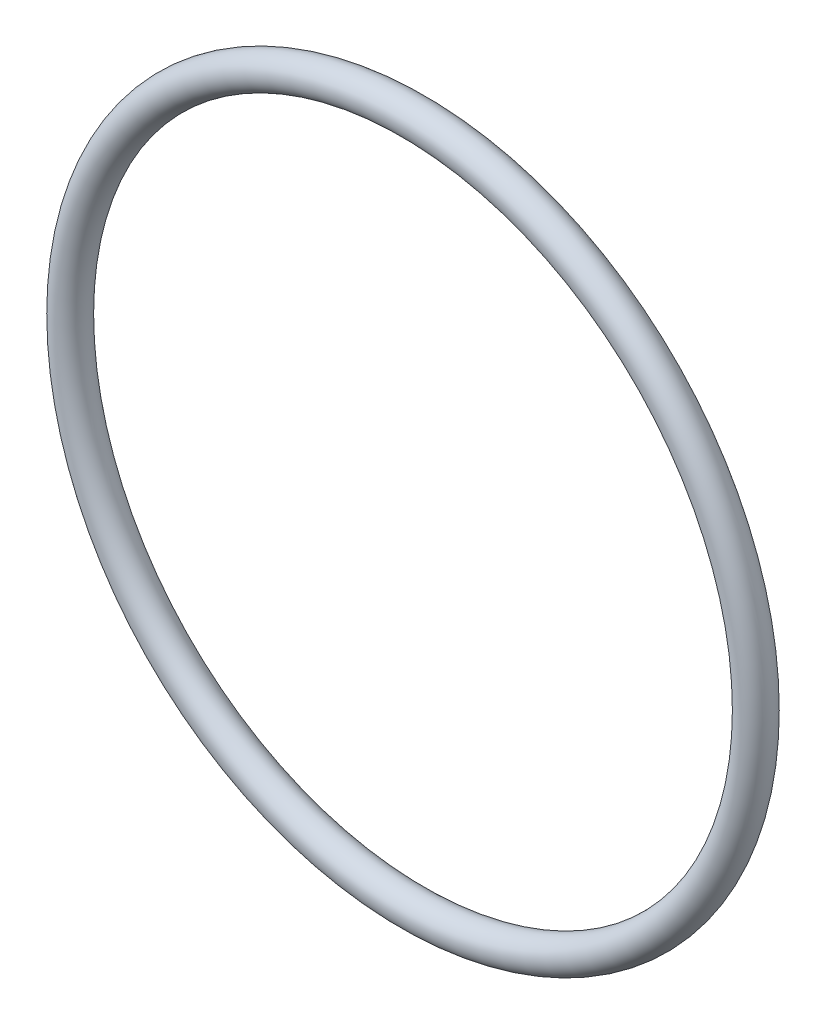
ISO-10303-21;
HEADER;
FILE_DESCRIPTION(('STEP AP214'),'2;1');
FILE_NAME('part.step','',(''),(''),'','','');
FILE_SCHEMA(('AUTOMOTIVE_DESIGN { 1 0 10303 214 1 1 1 1 }'));
ENDSEC;
DATA;
#1=APPLICATION_CONTEXT('core data for automotive mechanical design processes');
#2=APPLICATION_PROTOCOL_DEFINITION('international standard','automotive_design',2000,#1);
#3=PRODUCT_CONTEXT('',#1,'mechanical');
#4=PRODUCT('Part','Part','',(#3));
#5=PRODUCT_RELATED_PRODUCT_CATEGORY('part','',(#4));
#6=PRODUCT_DEFINITION_FORMATION('','',#4);
#7=PRODUCT_DEFINITION_CONTEXT('part definition',#1,'design');
#8=PRODUCT_DEFINITION('design','',#6,#7);
#9=PRODUCT_DEFINITION_SHAPE('','',#8);
#10=(LENGTH_UNIT() NAMED_UNIT(*) SI_UNIT(.MILLI.,.METRE.));
#11=(NAMED_UNIT(*) PLANE_ANGLE_UNIT() SI_UNIT($,.RADIAN.));
#12=(NAMED_UNIT(*) SI_UNIT($,.STERADIAN.) SOLID_ANGLE_UNIT());
#13=UNCERTAINTY_MEASURE_WITH_UNIT(LENGTH_MEASURE(1.E-05),#10,'distance_accuracy_value','');
#14=(GEOMETRIC_REPRESENTATION_CONTEXT(3) GLOBAL_UNCERTAINTY_ASSIGNED_CONTEXT((#13)) GLOBAL_UNIT_ASSIGNED_CONTEXT((#10,
#11,#12)) REPRESENTATION_CONTEXT('',''));
#15=CARTESIAN_POINT('',(0.,0.,0.));
#16=DIRECTION('',(0.,0.,1.));
#17=DIRECTION('',(1.,0.,0.));
#18=AXIS2_PLACEMENT_3D('',#15,#16,#17);
#19=CARTESIAN_POINT('',(0.,0.,0.));
#20=DIRECTION('',(0.,0.,1.));
#21=DIRECTION('',(1.,0.,0.));
#22=AXIS2_PLACEMENT_3D('',#19,#20,#21);
#23=TOROIDAL_SURFACE('',#22,36.4871,1.76530000000001);
#24=CARTESIAN_POINT('',(38.2524,0.,0.));
#25=VERTEX_POINT('',#24);
#26=VERTEX_LOOP('',#25);
#27=FACE_BOUND('',#26,.T.);
#28=ADVANCED_FACE('F28',(#27),#23,.T.);
#29=CLOSED_SHELL('',(#28));
#30=MANIFOLD_SOLID_BREP('B2',#29);
#31=ADVANCED_BREP_SHAPE_REPRESENTATION('',(#18,#30),#14);
#32=SHAPE_DEFINITION_REPRESENTATION(#9,#31);
ENDSEC;
END-ISO-10303-21;
